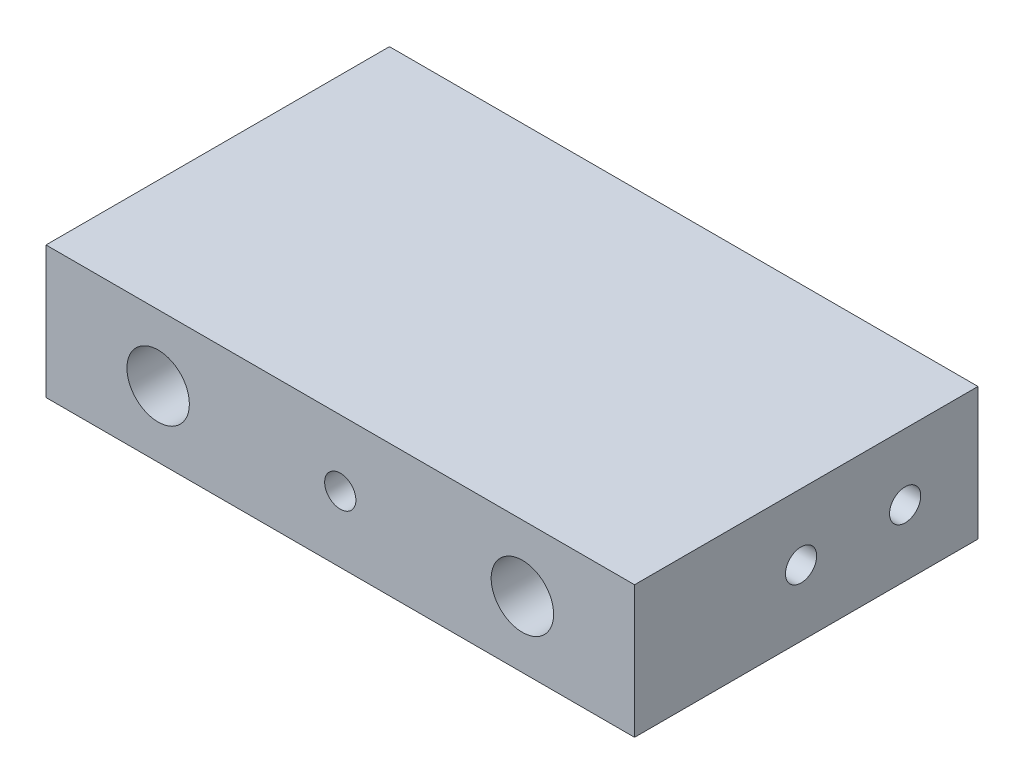
ISO-10303-21;
HEADER;
FILE_DESCRIPTION(('STEP AP214'),'2;1');
FILE_NAME('part.step','',(''),(''),'','','');
FILE_SCHEMA(('AUTOMOTIVE_DESIGN { 1 0 10303 214 1 1 1 1 }'));
ENDSEC;
DATA;
#1=APPLICATION_CONTEXT('core data for automotive mechanical design processes');
#2=APPLICATION_PROTOCOL_DEFINITION('international standard','automotive_design',2000,#1);
#3=PRODUCT_CONTEXT('',#1,'mechanical');
#4=PRODUCT('Part','Part','',(#3));
#5=PRODUCT_RELATED_PRODUCT_CATEGORY('part','',(#4));
#6=PRODUCT_DEFINITION_FORMATION('','',#4);
#7=PRODUCT_DEFINITION_CONTEXT('part definition',#1,'design');
#8=PRODUCT_DEFINITION('design','',#6,#7);
#9=PRODUCT_DEFINITION_SHAPE('','',#8);
#10=(LENGTH_UNIT() NAMED_UNIT(*) SI_UNIT(.MILLI.,.METRE.));
#11=(NAMED_UNIT(*) PLANE_ANGLE_UNIT() SI_UNIT($,.RADIAN.));
#12=(NAMED_UNIT(*) SI_UNIT($,.STERADIAN.) SOLID_ANGLE_UNIT());
#13=UNCERTAINTY_MEASURE_WITH_UNIT(LENGTH_MEASURE(1.E-05),#10,'distance_accuracy_value','');
#14=(GEOMETRIC_REPRESENTATION_CONTEXT(3) GLOBAL_UNCERTAINTY_ASSIGNED_CONTEXT((#13)) GLOBAL_UNIT_ASSIGNED_CONTEXT((#10,
#11,#12)) REPRESENTATION_CONTEXT('',''));
#15=CARTESIAN_POINT('',(0.,0.,0.));
#16=DIRECTION('',(0.,0.,1.));
#17=DIRECTION('',(1.,0.,0.));
#18=AXIS2_PLACEMENT_3D('',#15,#16,#17);
#19=CARTESIAN_POINT('',(-28.275,6.35,33.));
#20=DIRECTION('',(0.,1.,0.));
#21=DIRECTION('',(0.,0.,1.));
#22=AXIS2_PLACEMENT_3D('',#19,#20,#21);
#23=PLANE('',#22);
#24=DIRECTION('',(1.,0.,0.));
#25=VECTOR('',#24,1.);
#26=CARTESIAN_POINT('',(-28.275,6.35,0.));
#27=LINE('',#26,#25);
#28=CARTESIAN_POINT('',(-28.275,6.35,0.));
#29=VERTEX_POINT('',#28);
#30=CARTESIAN_POINT('',(28.275,6.35,0.));
#31=VERTEX_POINT('',#30);
#32=EDGE_CURVE('E103',#29,#31,#27,.T.);
#33=ORIENTED_EDGE('',*,*,#32,.F.);
#34=DIRECTION('',(0.,0.,-1.));
#35=VECTOR('',#34,1.);
#36=CARTESIAN_POINT('',(-28.275,6.35,33.));
#37=LINE('',#36,#35);
#38=CARTESIAN_POINT('',(-28.275,6.35,33.));
#39=VERTEX_POINT('',#38);
#40=EDGE_CURVE('E11',#39,#29,#37,.T.);
#41=ORIENTED_EDGE('',*,*,#40,.F.);
#42=DIRECTION('',(1.,0.,0.));
#43=VECTOR('',#42,1.);
#44=CARTESIAN_POINT('',(-28.275,6.35,33.));
#45=LINE('',#44,#43);
#46=CARTESIAN_POINT('',(28.275,6.35,33.));
#47=VERTEX_POINT('',#46);
#48=EDGE_CURVE('E97',#39,#47,#45,.T.);
#49=ORIENTED_EDGE('',*,*,#48,.T.);
#50=DIRECTION('',(0.,0.,-1.));
#51=VECTOR('',#50,1.);
#52=CARTESIAN_POINT('',(28.275,6.35,33.));
#53=LINE('',#52,#51);
#54=EDGE_CURVE('E40',#47,#31,#53,.T.);
#55=ORIENTED_EDGE('',*,*,#54,.T.);
#56=EDGE_LOOP('',(#33,#41,#49,#55));
#57=FACE_BOUND('',#56,.T.);
#58=ADVANCED_FACE('F37',(#57),#23,.T.);
#59=CARTESIAN_POINT('',(-28.275,6.35,33.));
#60=DIRECTION('',(1.,0.,0.));
#61=DIRECTION('',(0.,0.,-1.));
#62=AXIS2_PLACEMENT_3D('',#59,#60,#61);
#63=PLANE('',#62);
#64=CARTESIAN_POINT('',(-28.275,0.,7.));
#65=DIRECTION('',(-1.,0.,0.));
#66=DIRECTION('',(0.,0.,1.));
#67=AXIS2_PLACEMENT_3D('',#64,#65,#66);
#68=CIRCLE('',#67,1.5);
#69=CARTESIAN_POINT('',(-28.275,0.,8.5));
#70=VERTEX_POINT('',#69);
#71=EDGE_CURVE('E142',#70,#70,#68,.T.);
#72=ORIENTED_EDGE('',*,*,#71,.F.);
#73=EDGE_LOOP('',(#72));
#74=FACE_BOUND('',#73,.T.);
#75=CARTESIAN_POINT('',(-28.275,0.,17.));
#76=DIRECTION('',(-1.,0.,0.));
#77=DIRECTION('',(0.,0.,1.));
#78=AXIS2_PLACEMENT_3D('',#75,#76,#77);
#79=CIRCLE('',#78,1.5);
#80=CARTESIAN_POINT('',(-28.275,0.,18.5));
#81=VERTEX_POINT('',#80);
#82=EDGE_CURVE('E143',#81,#81,#79,.T.);
#83=ORIENTED_EDGE('',*,*,#82,.F.);
#84=EDGE_LOOP('',(#83));
#85=FACE_BOUND('',#84,.T.);
#86=DIRECTION('',(0.,-1.,0.));
#87=VECTOR('',#86,1.);
#88=CARTESIAN_POINT('',(-28.275,6.35,0.));
#89=LINE('',#88,#87);
#90=CARTESIAN_POINT('',(-28.275,-6.35,0.));
#91=VERTEX_POINT('',#90);
#92=EDGE_CURVE('E70',#29,#91,#89,.T.);
#93=ORIENTED_EDGE('',*,*,#92,.T.);
#94=DIRECTION('',(0.,0.,-1.));
#95=VECTOR('',#94,1.);
#96=CARTESIAN_POINT('',(-28.275,-6.35,33.));
#97=LINE('',#96,#95);
#98=CARTESIAN_POINT('',(-28.275,-6.35,33.));
#99=VERTEX_POINT('',#98);
#100=EDGE_CURVE('E46',#99,#91,#97,.T.);
#101=ORIENTED_EDGE('',*,*,#100,.F.);
#102=DIRECTION('',(0.,-1.,0.));
#103=VECTOR('',#102,1.);
#104=CARTESIAN_POINT('',(-28.275,6.35,33.));
#105=LINE('',#104,#103);
#106=EDGE_CURVE('E87',#39,#99,#105,.T.);
#107=ORIENTED_EDGE('',*,*,#106,.F.);
#108=ORIENTED_EDGE('',*,*,#40,.T.);
#109=EDGE_LOOP('',(#93,#101,#107,#108));
#110=FACE_BOUND('',#109,.T.);
#111=ADVANCED_FACE('F114',(#74,#85,#110),#63,.F.);
#112=CARTESIAN_POINT('',(-28.275,-6.35,33.));
#113=DIRECTION('',(0.,1.,0.));
#114=DIRECTION('',(0.,0.,1.));
#115=AXIS2_PLACEMENT_3D('',#112,#113,#114);
#116=PLANE('',#115);
#117=DIRECTION('',(1.,0.,0.));
#118=VECTOR('',#117,1.);
#119=CARTESIAN_POINT('',(-28.275,-6.35,0.));
#120=LINE('',#119,#118);
#121=CARTESIAN_POINT('',(28.275,-6.35,0.));
#122=VERTEX_POINT('',#121);
#123=EDGE_CURVE('E94',#91,#122,#120,.T.);
#124=ORIENTED_EDGE('',*,*,#123,.T.);
#125=DIRECTION('',(0.,0.,-1.));
#126=VECTOR('',#125,1.);
#127=CARTESIAN_POINT('',(28.275,-6.35,33.));
#128=LINE('',#127,#126);
#129=CARTESIAN_POINT('',(28.275,-6.35,33.));
#130=VERTEX_POINT('',#129);
#131=EDGE_CURVE('E91',#130,#122,#128,.T.);
#132=ORIENTED_EDGE('',*,*,#131,.F.);
#133=DIRECTION('',(1.,0.,0.));
#134=VECTOR('',#133,1.);
#135=CARTESIAN_POINT('',(-28.275,-6.35,33.));
#136=LINE('',#135,#134);
#137=EDGE_CURVE('E82',#99,#130,#136,.T.);
#138=ORIENTED_EDGE('',*,*,#137,.F.);
#139=ORIENTED_EDGE('',*,*,#100,.T.);
#140=EDGE_LOOP('',(#124,#132,#138,#139));
#141=FACE_BOUND('',#140,.T.);
#142=ADVANCED_FACE('F92',(#141),#116,.F.);
#143=CARTESIAN_POINT('',(28.275,6.35,33.));
#144=DIRECTION('',(1.,0.,0.));
#145=DIRECTION('',(0.,1.,0.));
#146=AXIS2_PLACEMENT_3D('',#143,#144,#145);
#147=PLANE('',#146);
#148=CARTESIAN_POINT('',(28.275,0.,7.));
#149=DIRECTION('',(-1.,0.,0.));
#150=DIRECTION('',(0.,0.,1.));
#151=AXIS2_PLACEMENT_3D('',#148,#149,#150);
#152=CIRCLE('',#151,1.5);
#153=CARTESIAN_POINT('',(28.275,0.,8.5));
#154=VERTEX_POINT('',#153);
#155=EDGE_CURVE('E137',#154,#154,#152,.T.);
#156=ORIENTED_EDGE('',*,*,#155,.T.);
#157=EDGE_LOOP('',(#156));
#158=FACE_BOUND('',#157,.T.);
#159=CARTESIAN_POINT('',(28.275,0.,17.));
#160=DIRECTION('',(-1.,0.,0.));
#161=DIRECTION('',(0.,0.,1.));
#162=AXIS2_PLACEMENT_3D('',#159,#160,#161);
#163=CIRCLE('',#162,1.5);
#164=CARTESIAN_POINT('',(28.275,0.,18.5));
#165=VERTEX_POINT('',#164);
#166=EDGE_CURVE('E140',#165,#165,#163,.T.);
#167=ORIENTED_EDGE('',*,*,#166,.T.);
#168=EDGE_LOOP('',(#167));
#169=FACE_BOUND('',#168,.T.);
#170=DIRECTION('',(0.,-1.,0.));
#171=VECTOR('',#170,1.);
#172=CARTESIAN_POINT('',(28.275,6.35,0.));
#173=LINE('',#172,#171);
#174=EDGE_CURVE('E106',#31,#122,#173,.T.);
#175=ORIENTED_EDGE('',*,*,#174,.F.);
#176=ORIENTED_EDGE('',*,*,#54,.F.);
#177=DIRECTION('',(0.,-1.,0.));
#178=VECTOR('',#177,1.);
#179=CARTESIAN_POINT('',(28.275,6.35,33.));
#180=LINE('',#179,#178);
#181=EDGE_CURVE('E86',#47,#130,#180,.T.);
#182=ORIENTED_EDGE('',*,*,#181,.T.);
#183=ORIENTED_EDGE('',*,*,#131,.T.);
#184=EDGE_LOOP('',(#175,#176,#182,#183));
#185=FACE_BOUND('',#184,.T.);
#186=ADVANCED_FACE('F96',(#158,#169,#185),#147,.T.);
#187=CARTESIAN_POINT('',(0.,0.,33.));
#188=DIRECTION('',(0.,0.,-1.));
#189=DIRECTION('',(-1.,0.,0.));
#190=AXIS2_PLACEMENT_3D('',#187,#188,#189);
#191=PLANE('',#190);
#192=CARTESIAN_POINT('',(-17.5,0.,33.));
#193=DIRECTION('',(0.,0.,1.));
#194=DIRECTION('',(1.,0.,0.));
#195=AXIS2_PLACEMENT_3D('',#192,#193,#194);
#196=CIRCLE('',#195,3.);
#197=CARTESIAN_POINT('',(-14.5,0.,33.));
#198=VERTEX_POINT('',#197);
#199=EDGE_CURVE('E153',#198,#198,#196,.T.);
#200=ORIENTED_EDGE('',*,*,#199,.F.);
#201=EDGE_LOOP('',(#200));
#202=FACE_BOUND('',#201,.T.);
#203=CARTESIAN_POINT('',(17.5,0.,33.));
#204=DIRECTION('',(0.,0.,1.));
#205=DIRECTION('',(1.,0.,0.));
#206=AXIS2_PLACEMENT_3D('',#203,#204,#205);
#207=CIRCLE('',#206,3.);
#208=CARTESIAN_POINT('',(20.5,0.,33.));
#209=VERTEX_POINT('',#208);
#210=EDGE_CURVE('E159',#209,#209,#207,.T.);
#211=ORIENTED_EDGE('',*,*,#210,.F.);
#212=EDGE_LOOP('',(#211));
#213=FACE_BOUND('',#212,.T.);
#214=CARTESIAN_POINT('',(0.,0.,33.));
#215=DIRECTION('',(0.,0.,1.));
#216=DIRECTION('',(1.,0.,0.));
#217=AXIS2_PLACEMENT_3D('',#214,#215,#216);
#218=CIRCLE('',#217,1.5);
#219=CARTESIAN_POINT('',(1.5,0.,33.));
#220=VERTEX_POINT('',#219);
#221=EDGE_CURVE('E164',#220,#220,#218,.T.);
#222=ORIENTED_EDGE('',*,*,#221,.F.);
#223=EDGE_LOOP('',(#222));
#224=FACE_BOUND('',#223,.T.);
#225=ORIENTED_EDGE('',*,*,#48,.F.);
#226=ORIENTED_EDGE('',*,*,#106,.T.);
#227=ORIENTED_EDGE('',*,*,#137,.T.);
#228=ORIENTED_EDGE('',*,*,#181,.F.);
#229=EDGE_LOOP('',(#225,#226,#227,#228));
#230=FACE_BOUND('',#229,.T.);
#231=ADVANCED_FACE('F85',(#202,#213,#224,#230),#191,.F.);
#232=CARTESIAN_POINT('',(0.,0.,0.));
#233=DIRECTION('',(0.,0.,-1.));
#234=DIRECTION('',(-1.,0.,0.));
#235=AXIS2_PLACEMENT_3D('',#232,#233,#234);
#236=PLANE('',#235);
#237=ORIENTED_EDGE('',*,*,#32,.T.);
#238=ORIENTED_EDGE('',*,*,#174,.T.);
#239=ORIENTED_EDGE('',*,*,#123,.F.);
#240=ORIENTED_EDGE('',*,*,#92,.F.);
#241=EDGE_LOOP('',(#237,#238,#239,#240));
#242=FACE_BOUND('',#241,.T.);
#243=ADVANCED_FACE('F112',(#242),#236,.T.);
#244=CARTESIAN_POINT('',(0.,0.,23.));
#245=DIRECTION('',(0.,0.,1.));
#246=DIRECTION('',(1.,0.,0.));
#247=AXIS2_PLACEMENT_3D('',#244,#245,#246);
#248=CYLINDRICAL_SURFACE('',#247,1.5);
#249=CARTESIAN_POINT('',(0.,0.,23.));
#250=DIRECTION('',(0.,0.,1.));
#251=DIRECTION('',(1.,0.,0.));
#252=AXIS2_PLACEMENT_3D('',#249,#250,#251);
#253=CIRCLE('',#252,1.5);
#254=CARTESIAN_POINT('',(1.5,0.,23.));
#255=VERTEX_POINT('',#254);
#256=EDGE_CURVE('E162',#255,#255,#253,.T.);
#257=ORIENTED_EDGE('',*,*,#256,.F.);
#258=EDGE_LOOP('',(#257));
#259=FACE_BOUND('',#258,.T.);
#260=ORIENTED_EDGE('',*,*,#221,.T.);
#261=EDGE_LOOP('',(#260));
#262=FACE_BOUND('',#261,.T.);
#263=ADVANCED_FACE('F168',(#259,#262),#248,.F.);
#264=CARTESIAN_POINT('',(0.,0.,23.));
#265=DIRECTION('',(0.,0.,1.));
#266=DIRECTION('',(1.,0.,0.));
#267=AXIS2_PLACEMENT_3D('',#264,#265,#266);
#268=PLANE('',#267);
#269=ORIENTED_EDGE('',*,*,#256,.T.);
#270=EDGE_LOOP('',(#269));
#271=FACE_BOUND('',#270,.T.);
#272=ADVANCED_FACE('F171',(#271),#268,.T.);
#273=CARTESIAN_POINT('',(17.5,0.,23.));
#274=DIRECTION('',(0.,0.,1.));
#275=DIRECTION('',(1.,0.,0.));
#276=AXIS2_PLACEMENT_3D('',#273,#274,#275);
#277=CYLINDRICAL_SURFACE('',#276,3.);
#278=CARTESIAN_POINT('',(17.5,0.,23.));
#279=DIRECTION('',(0.,0.,1.));
#280=DIRECTION('',(1.,0.,0.));
#281=AXIS2_PLACEMENT_3D('',#278,#279,#280);
#282=CIRCLE('',#281,3.);
#283=CARTESIAN_POINT('',(20.5,0.,23.));
#284=VERTEX_POINT('',#283);
#285=EDGE_CURVE('E156',#284,#284,#282,.T.);
#286=ORIENTED_EDGE('',*,*,#285,.F.);
#287=EDGE_LOOP('',(#286));
#288=FACE_BOUND('',#287,.T.);
#289=ORIENTED_EDGE('',*,*,#210,.T.);
#290=EDGE_LOOP('',(#289));
#291=FACE_BOUND('',#290,.T.);
#292=ADVANCED_FACE('F178',(#288,#291),#277,.F.);
#293=CARTESIAN_POINT('',(0.,0.,23.));
#294=DIRECTION('',(0.,0.,1.));
#295=DIRECTION('',(1.,0.,0.));
#296=AXIS2_PLACEMENT_3D('',#293,#294,#295);
#297=PLANE('',#296);
#298=ORIENTED_EDGE('',*,*,#285,.T.);
#299=EDGE_LOOP('',(#298));
#300=FACE_BOUND('',#299,.T.);
#301=ADVANCED_FACE('F185',(#300),#297,.T.);
#302=CARTESIAN_POINT('',(-17.5,0.,23.));
#303=DIRECTION('',(0.,0.,1.));
#304=DIRECTION('',(1.,0.,0.));
#305=AXIS2_PLACEMENT_3D('',#302,#303,#304);
#306=CYLINDRICAL_SURFACE('',#305,3.);
#307=CARTESIAN_POINT('',(-17.5,0.,23.));
#308=DIRECTION('',(0.,0.,1.));
#309=DIRECTION('',(1.,0.,0.));
#310=AXIS2_PLACEMENT_3D('',#307,#308,#309);
#311=CIRCLE('',#310,3.);
#312=CARTESIAN_POINT('',(-14.5,0.,23.));
#313=VERTEX_POINT('',#312);
#314=EDGE_CURVE('E107',#313,#313,#311,.T.);
#315=ORIENTED_EDGE('',*,*,#314,.F.);
#316=EDGE_LOOP('',(#315));
#317=FACE_BOUND('',#316,.T.);
#318=ORIENTED_EDGE('',*,*,#199,.T.);
#319=EDGE_LOOP('',(#318));
#320=FACE_BOUND('',#319,.T.);
#321=ADVANCED_FACE('F189',(#317,#320),#306,.F.);
#322=CARTESIAN_POINT('',(0.,0.,23.));
#323=DIRECTION('',(0.,0.,1.));
#324=DIRECTION('',(1.,0.,0.));
#325=AXIS2_PLACEMENT_3D('',#322,#323,#324);
#326=PLANE('',#325);
#327=ORIENTED_EDGE('',*,*,#314,.T.);
#328=EDGE_LOOP('',(#327));
#329=FACE_BOUND('',#328,.T.);
#330=ADVANCED_FACE('F193',(#329),#326,.T.);
#331=CARTESIAN_POINT('',(28.275,0.,17.));
#332=DIRECTION('',(-1.,0.,0.));
#333=DIRECTION('',(0.,0.,1.));
#334=AXIS2_PLACEMENT_3D('',#331,#332,#333);
#335=CYLINDRICAL_SURFACE('',#334,1.5);
#336=ORIENTED_EDGE('',*,*,#166,.F.);
#337=EDGE_LOOP('',(#336));
#338=FACE_BOUND('',#337,.T.);
#339=ORIENTED_EDGE('',*,*,#82,.T.);
#340=EDGE_LOOP('',(#339));
#341=FACE_BOUND('',#340,.T.);
#342=ADVANCED_FACE('F197',(#338,#341),#335,.F.);
#343=CARTESIAN_POINT('',(28.275,0.,7.));
#344=DIRECTION('',(-1.,0.,0.));
#345=DIRECTION('',(0.,0.,1.));
#346=AXIS2_PLACEMENT_3D('',#343,#344,#345);
#347=CYLINDRICAL_SURFACE('',#346,1.5);
#348=ORIENTED_EDGE('',*,*,#155,.F.);
#349=EDGE_LOOP('',(#348));
#350=FACE_BOUND('',#349,.T.);
#351=ORIENTED_EDGE('',*,*,#71,.T.);
#352=EDGE_LOOP('',(#351));
#353=FACE_BOUND('',#352,.T.);
#354=ADVANCED_FACE('F201',(#350,#353),#347,.F.);
#355=CLOSED_SHELL('',(#58,#111,#142,#186,#231,#243,#263,#272,#292,#301,#321,#330,#342,#354));
#356=MANIFOLD_SOLID_BREP('B2',#355);
#357=ADVANCED_BREP_SHAPE_REPRESENTATION('',(#18,#356),#14);
#358=SHAPE_DEFINITION_REPRESENTATION(#9,#357);
ENDSEC;
END-ISO-10303-21;
